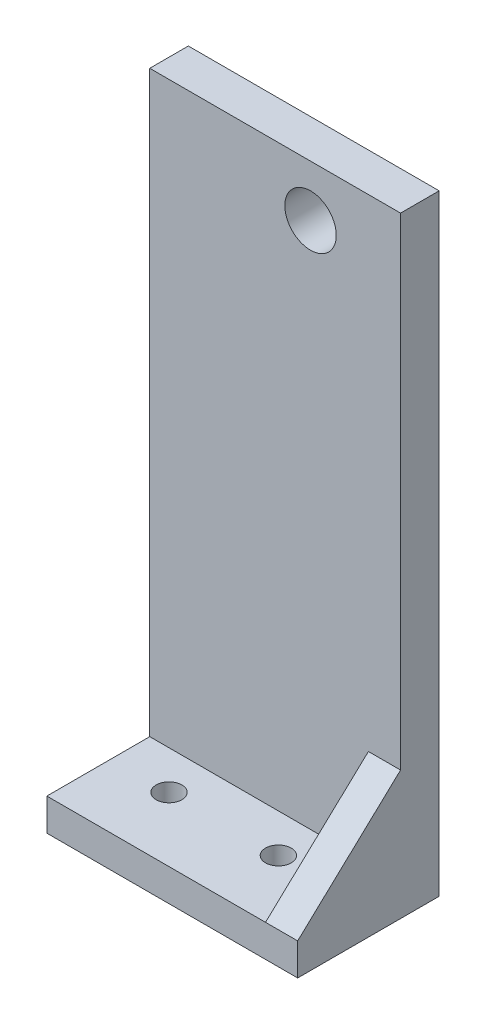
ISO-10303-21;
HEADER;
FILE_DESCRIPTION(('STEP AP214'),'2;1');
FILE_NAME('part.step','',(''),(''),'','','');
FILE_SCHEMA(('AUTOMOTIVE_DESIGN { 1 0 10303 214 1 1 1 1 }'));
ENDSEC;
DATA;
#1=APPLICATION_CONTEXT('core data for automotive mechanical design processes');
#2=APPLICATION_PROTOCOL_DEFINITION('international standard','automotive_design',2000,#1);
#3=PRODUCT_CONTEXT('',#1,'mechanical');
#4=PRODUCT('Part','Part','',(#3));
#5=PRODUCT_RELATED_PRODUCT_CATEGORY('part','',(#4));
#6=PRODUCT_DEFINITION_FORMATION('','',#4);
#7=PRODUCT_DEFINITION_CONTEXT('part definition',#1,'design');
#8=PRODUCT_DEFINITION('design','',#6,#7);
#9=PRODUCT_DEFINITION_SHAPE('','',#8);
#10=(LENGTH_UNIT() NAMED_UNIT(*) SI_UNIT(.MILLI.,.METRE.));
#11=(NAMED_UNIT(*) PLANE_ANGLE_UNIT() SI_UNIT($,.RADIAN.));
#12=(NAMED_UNIT(*) SI_UNIT($,.STERADIAN.) SOLID_ANGLE_UNIT());
#13=UNCERTAINTY_MEASURE_WITH_UNIT(LENGTH_MEASURE(1.E-05),#10,'distance_accuracy_value','');
#14=(GEOMETRIC_REPRESENTATION_CONTEXT(3) GLOBAL_UNCERTAINTY_ASSIGNED_CONTEXT((#13)) GLOBAL_UNIT_ASSIGNED_CONTEXT((#10,
#11,#12)) REPRESENTATION_CONTEXT('',''));
#15=CARTESIAN_POINT('',(0.,0.,0.));
#16=DIRECTION('',(0.,0.,1.));
#17=DIRECTION('',(1.,0.,0.));
#18=AXIS2_PLACEMENT_3D('',#15,#16,#17);
#19=CARTESIAN_POINT('',(-9.,5.,0.));
#20=DIRECTION('',(-1.,0.,0.));
#21=DIRECTION('',(0.,0.,1.));
#22=AXIS2_PLACEMENT_3D('',#19,#20,#21);
#23=PLANE('',#22);
#24=DIRECTION('',(0.,0.,-1.));
#25=VECTOR('',#24,1.);
#26=CARTESIAN_POINT('',(-9.,0.,0.));
#27=LINE('',#26,#25);
#28=CARTESIAN_POINT('',(-9.,0.,10.));
#29=VERTEX_POINT('',#28);
#30=CARTESIAN_POINT('',(-9.,0.,-12.));
#31=VERTEX_POINT('',#30);
#32=EDGE_CURVE('E185',#29,#31,#27,.T.);
#33=ORIENTED_EDGE('',*,*,#32,.F.);
#34=DIRECTION('',(0.,-1.,0.));
#35=VECTOR('',#34,1.);
#36=CARTESIAN_POINT('',(-9.,5.,10.));
#37=LINE('',#36,#35);
#38=CARTESIAN_POINT('',(-9.,5.,10.));
#39=VERTEX_POINT('',#38);
#40=EDGE_CURVE('E11',#39,#29,#37,.T.);
#41=ORIENTED_EDGE('',*,*,#40,.F.);
#42=DIRECTION('',(0.,0.,-1.));
#43=VECTOR('',#42,1.);
#44=CARTESIAN_POINT('',(-9.,5.,0.));
#45=LINE('',#44,#43);
#46=CARTESIAN_POINT('',(-9.,5.,-6.));
#47=VERTEX_POINT('',#46);
#48=EDGE_CURVE('E171',#39,#47,#45,.T.);
#49=ORIENTED_EDGE('',*,*,#48,.T.);
#50=DIRECTION('',(0.,1.,0.));
#51=VECTOR('',#50,1.);
#52=CARTESIAN_POINT('',(-9.,0.,-6.));
#53=LINE('',#52,#51);
#54=CARTESIAN_POINT('',(-9.,95.,-6.));
#55=VERTEX_POINT('',#54);
#56=EDGE_CURVE('E140',#47,#55,#53,.T.);
#57=ORIENTED_EDGE('',*,*,#56,.T.);
#58=DIRECTION('',(0.,0.,-1.));
#59=VECTOR('',#58,1.);
#60=CARTESIAN_POINT('',(-9.,95.,-6.));
#61=LINE('',#60,#59);
#62=CARTESIAN_POINT('',(-9.,95.,-12.));
#63=VERTEX_POINT('',#62);
#64=EDGE_CURVE('E149',#55,#63,#61,.T.);
#65=ORIENTED_EDGE('',*,*,#64,.T.);
#66=DIRECTION('',(0.,-1.,0.));
#67=VECTOR('',#66,1.);
#68=CARTESIAN_POINT('',(-9.,5.,-12.));
#69=LINE('',#68,#67);
#70=EDGE_CURVE('E177',#63,#31,#69,.T.);
#71=ORIENTED_EDGE('',*,*,#70,.T.);
#72=EDGE_LOOP('',(#33,#41,#49,#57,#65,#71));
#73=FACE_BOUND('',#72,.T.);
#74=ADVANCED_FACE('F41',(#73),#23,.T.);
#75=CARTESIAN_POINT('',(0.,5.,10.));
#76=DIRECTION('',(0.,0.,1.));
#77=DIRECTION('',(1.,0.,0.));
#78=AXIS2_PLACEMENT_3D('',#75,#76,#77);
#79=PLANE('',#78);
#80=DIRECTION('',(-1.,0.,0.));
#81=VECTOR('',#80,1.);
#82=CARTESIAN_POINT('',(0.,0.,10.));
#83=LINE('',#82,#81);
#84=CARTESIAN_POINT('',(30.,0.,10.));
#85=VERTEX_POINT('',#84);
#86=EDGE_CURVE('E189',#85,#29,#83,.T.);
#87=ORIENTED_EDGE('',*,*,#86,.F.);
#88=DIRECTION('',(0.,-1.,0.));
#89=VECTOR('',#88,1.);
#90=CARTESIAN_POINT('',(30.,5.,10.));
#91=LINE('',#90,#89);
#92=CARTESIAN_POINT('',(30.,5.,10.));
#93=VERTEX_POINT('',#92);
#94=EDGE_CURVE('E50',#93,#85,#91,.T.);
#95=ORIENTED_EDGE('',*,*,#94,.F.);
#96=DIRECTION('',(-1.,0.,0.));
#97=VECTOR('',#96,1.);
#98=CARTESIAN_POINT('',(0.,5.,10.));
#99=LINE('',#98,#97);
#100=CARTESIAN_POINT('',(25.,5.,10.));
#101=VERTEX_POINT('',#100);
#102=EDGE_CURVE('E126',#93,#101,#99,.T.);
#103=ORIENTED_EDGE('',*,*,#102,.T.);
#104=EDGE_CURVE('E57',#101,#39,#99,.T.);
#105=ORIENTED_EDGE('',*,*,#104,.T.);
#106=ORIENTED_EDGE('',*,*,#40,.T.);
#107=EDGE_LOOP('',(#87,#95,#103,#105,#106));
#108=FACE_BOUND('',#107,.T.);
#109=ADVANCED_FACE('F208',(#108),#79,.T.);
#110=CARTESIAN_POINT('',(30.,5.,0.));
#111=DIRECTION('',(1.,0.,0.));
#112=DIRECTION('',(0.,0.,-1.));
#113=AXIS2_PLACEMENT_3D('',#110,#111,#112);
#114=PLANE('',#113);
#115=DIRECTION('',(0.,-0.68394112888133,0.729537204140085));
#116=VECTOR('',#115,1.);
#117=CARTESIAN_POINT('',(30.,20.,-6.));
#118=LINE('',#117,#116);
#119=CARTESIAN_POINT('',(30.,20.,-6.));
#120=VERTEX_POINT('',#119);
#121=EDGE_CURVE('E108',#120,#93,#118,.T.);
#122=ORIENTED_EDGE('',*,*,#121,.T.);
#123=ORIENTED_EDGE('',*,*,#94,.T.);
#124=DIRECTION('',(0.,0.,1.));
#125=VECTOR('',#124,1.);
#126=CARTESIAN_POINT('',(30.,0.,0.));
#127=LINE('',#126,#125);
#128=CARTESIAN_POINT('',(30.,0.,-12.));
#129=VERTEX_POINT('',#128);
#130=EDGE_CURVE('E193',#129,#85,#127,.T.);
#131=ORIENTED_EDGE('',*,*,#130,.F.);
#132=DIRECTION('',(0.,-1.,0.));
#133=VECTOR('',#132,1.);
#134=CARTESIAN_POINT('',(30.,5.,-12.));
#135=LINE('',#134,#133);
#136=CARTESIAN_POINT('',(30.,95.,-12.));
#137=VERTEX_POINT('',#136);
#138=EDGE_CURVE('E202',#137,#129,#135,.T.);
#139=ORIENTED_EDGE('',*,*,#138,.F.);
#140=DIRECTION('',(0.,0.,-1.));
#141=VECTOR('',#140,1.);
#142=CARTESIAN_POINT('',(30.,95.,-6.));
#143=LINE('',#142,#141);
#144=CARTESIAN_POINT('',(30.,95.,-6.));
#145=VERTEX_POINT('',#144);
#146=EDGE_CURVE('E110',#145,#137,#143,.T.);
#147=ORIENTED_EDGE('',*,*,#146,.F.);
#148=DIRECTION('',(0.,1.,0.));
#149=VECTOR('',#148,1.);
#150=CARTESIAN_POINT('',(30.,0.,-6.));
#151=LINE('',#150,#149);
#152=EDGE_CURVE('E105',#120,#145,#151,.T.);
#153=ORIENTED_EDGE('',*,*,#152,.F.);
#154=EDGE_LOOP('',(#122,#123,#131,#139,#147,#153));
#155=FACE_BOUND('',#154,.T.);
#156=ADVANCED_FACE('F106',(#155),#114,.T.);
#157=CARTESIAN_POINT('',(0.,5.,0.));
#158=DIRECTION('',(0.,-1.,0.));
#159=DIRECTION('',(0.,0.,-1.));
#160=AXIS2_PLACEMENT_3D('',#157,#158,#159);
#161=CYLINDRICAL_SURFACE('',#160,2.);
#162=CARTESIAN_POINT('',(0.,5.,0.));
#163=DIRECTION('',(0.,1.,0.));
#164=DIRECTION('',(0.,0.,1.));
#165=AXIS2_PLACEMENT_3D('',#162,#163,#164);
#166=CIRCLE('',#165,2.);
#167=CARTESIAN_POINT('',(0.,5.,2.));
#168=VERTEX_POINT('',#167);
#169=EDGE_CURVE('E166',#168,#168,#166,.T.);
#170=ORIENTED_EDGE('',*,*,#169,.T.);
#171=EDGE_LOOP('',(#170));
#172=FACE_BOUND('',#171,.T.);
#173=CARTESIAN_POINT('',(0.,0.,0.));
#174=DIRECTION('',(0.,1.,0.));
#175=DIRECTION('',(0.,0.,1.));
#176=AXIS2_PLACEMENT_3D('',#173,#174,#175);
#177=CIRCLE('',#176,2.);
#178=CARTESIAN_POINT('',(0.,0.,2.));
#179=VERTEX_POINT('',#178);
#180=EDGE_CURVE('E181',#179,#179,#177,.T.);
#181=ORIENTED_EDGE('',*,*,#180,.F.);
#182=EDGE_LOOP('',(#181));
#183=FACE_BOUND('',#182,.T.);
#184=ADVANCED_FACE('F244',(#172,#183),#161,.F.);
#185=CARTESIAN_POINT('',(17.,5.,0.));
#186=DIRECTION('',(0.,-1.,0.));
#187=DIRECTION('',(0.,0.,-1.));
#188=AXIS2_PLACEMENT_3D('',#185,#186,#187);
#189=CYLINDRICAL_SURFACE('',#188,2.);
#190=CARTESIAN_POINT('',(17.,5.,0.));
#191=DIRECTION('',(0.,1.,0.));
#192=DIRECTION('',(0.,0.,1.));
#193=AXIS2_PLACEMENT_3D('',#190,#191,#192);
#194=CIRCLE('',#193,2.);
#195=CARTESIAN_POINT('',(17.,5.,2.));
#196=VERTEX_POINT('',#195);
#197=EDGE_CURVE('E162',#196,#196,#194,.T.);
#198=ORIENTED_EDGE('',*,*,#197,.T.);
#199=EDGE_LOOP('',(#198));
#200=FACE_BOUND('',#199,.T.);
#201=CARTESIAN_POINT('',(17.,0.,0.));
#202=DIRECTION('',(0.,1.,0.));
#203=DIRECTION('',(0.,0.,1.));
#204=AXIS2_PLACEMENT_3D('',#201,#202,#203);
#205=CIRCLE('',#204,2.);
#206=CARTESIAN_POINT('',(17.,0.,2.));
#207=VERTEX_POINT('',#206);
#208=EDGE_CURVE('E158',#207,#207,#205,.T.);
#209=ORIENTED_EDGE('',*,*,#208,.F.);
#210=EDGE_LOOP('',(#209));
#211=FACE_BOUND('',#210,.T.);
#212=ADVANCED_FACE('F43',(#200,#211),#189,.F.);
#213=CARTESIAN_POINT('',(0.,5.,-12.));
#214=DIRECTION('',(0.,0.,-1.));
#215=DIRECTION('',(-1.,0.,0.));
#216=AXIS2_PLACEMENT_3D('',#213,#214,#215);
#217=PLANE('',#216);
#218=DIRECTION('',(1.,0.,0.));
#219=VECTOR('',#218,1.);
#220=CARTESIAN_POINT('',(0.,0.,-12.));
#221=LINE('',#220,#219);
#222=EDGE_CURVE('E167',#31,#129,#221,.T.);
#223=ORIENTED_EDGE('',*,*,#222,.F.);
#224=ORIENTED_EDGE('',*,*,#70,.F.);
#225=DIRECTION('',(-1.,0.,0.));
#226=VECTOR('',#225,1.);
#227=CARTESIAN_POINT('',(0.,95.,-12.));
#228=LINE('',#227,#226);
#229=EDGE_CURVE('E141',#137,#63,#228,.T.);
#230=ORIENTED_EDGE('',*,*,#229,.F.);
#231=ORIENTED_EDGE('',*,*,#138,.T.);
#232=EDGE_LOOP('',(#223,#224,#230,#231));
#233=FACE_BOUND('',#232,.T.);
#234=CARTESIAN_POINT('',(16.,87.,-12.));
#235=DIRECTION('',(0.,0.,-1.));
#236=DIRECTION('',(-1.,0.,0.));
#237=AXIS2_PLACEMENT_3D('',#234,#235,#236);
#238=CIRCLE('',#237,4.);
#239=CARTESIAN_POINT('',(12.,87.,-12.));
#240=VERTEX_POINT('',#239);
#241=EDGE_CURVE('E122',#240,#240,#238,.T.);
#242=ORIENTED_EDGE('',*,*,#241,.F.);
#243=EDGE_LOOP('',(#242));
#244=FACE_BOUND('',#243,.T.);
#245=ADVANCED_FACE('F215',(#233,#244),#217,.T.);
#246=CARTESIAN_POINT('',(0.,5.,0.));
#247=DIRECTION('',(0.,1.,0.));
#248=DIRECTION('',(0.,0.,1.));
#249=AXIS2_PLACEMENT_3D('',#246,#247,#248);
#250=PLANE('',#249);
#251=DIRECTION('',(0.,0.,-1.));
#252=VECTOR('',#251,1.);
#253=CARTESIAN_POINT('',(25.,5.,10.));
#254=LINE('',#253,#252);
#255=CARTESIAN_POINT('',(25.,5.,-6.));
#256=VERTEX_POINT('',#255);
#257=EDGE_CURVE('E131',#101,#256,#254,.T.);
#258=ORIENTED_EDGE('',*,*,#257,.T.);
#259=DIRECTION('',(1.,0.,0.));
#260=VECTOR('',#259,1.);
#261=CARTESIAN_POINT('',(0.,5.,-6.));
#262=LINE('',#261,#260);
#263=EDGE_CURVE('E113',#47,#256,#262,.T.);
#264=ORIENTED_EDGE('',*,*,#263,.F.);
#265=ORIENTED_EDGE('',*,*,#48,.F.);
#266=ORIENTED_EDGE('',*,*,#104,.F.);
#267=EDGE_LOOP('',(#258,#264,#265,#266));
#268=FACE_BOUND('',#267,.T.);
#269=ORIENTED_EDGE('',*,*,#197,.F.);
#270=EDGE_LOOP('',(#269));
#271=FACE_BOUND('',#270,.T.);
#272=ORIENTED_EDGE('',*,*,#169,.F.);
#273=EDGE_LOOP('',(#272));
#274=FACE_BOUND('',#273,.T.);
#275=ADVANCED_FACE('F223',(#268,#271,#274),#250,.T.);
#276=CARTESIAN_POINT('',(0.,0.,0.));
#277=DIRECTION('',(0.,1.,0.));
#278=DIRECTION('',(0.,0.,1.));
#279=AXIS2_PLACEMENT_3D('',#276,#277,#278);
#280=PLANE('',#279);
#281=ORIENTED_EDGE('',*,*,#208,.T.);
#282=EDGE_LOOP('',(#281));
#283=FACE_BOUND('',#282,.T.);
#284=ORIENTED_EDGE('',*,*,#180,.T.);
#285=EDGE_LOOP('',(#284));
#286=FACE_BOUND('',#285,.T.);
#287=ORIENTED_EDGE('',*,*,#32,.T.);
#288=ORIENTED_EDGE('',*,*,#222,.T.);
#289=ORIENTED_EDGE('',*,*,#130,.T.);
#290=ORIENTED_EDGE('',*,*,#86,.T.);
#291=EDGE_LOOP('',(#287,#288,#289,#290));
#292=FACE_BOUND('',#291,.T.);
#293=ADVANCED_FACE('F212',(#283,#286,#292),#280,.F.);
#294=CARTESIAN_POINT('',(16.,87.,-6.));
#295=DIRECTION('',(0.,0.,-1.));
#296=DIRECTION('',(-1.,0.,0.));
#297=AXIS2_PLACEMENT_3D('',#294,#295,#296);
#298=CYLINDRICAL_SURFACE('',#297,4.);
#299=CARTESIAN_POINT('',(16.,87.,-6.));
#300=DIRECTION('',(0.,0.,-1.));
#301=DIRECTION('',(-1.,0.,0.));
#302=AXIS2_PLACEMENT_3D('',#299,#300,#301);
#303=CIRCLE('',#302,4.);
#304=CARTESIAN_POINT('',(12.,87.,-6.));
#305=VERTEX_POINT('',#304);
#306=EDGE_CURVE('E136',#305,#305,#303,.T.);
#307=ORIENTED_EDGE('',*,*,#306,.F.);
#308=EDGE_LOOP('',(#307));
#309=FACE_BOUND('',#308,.T.);
#310=ORIENTED_EDGE('',*,*,#241,.T.);
#311=EDGE_LOOP('',(#310));
#312=FACE_BOUND('',#311,.T.);
#313=ADVANCED_FACE('F257',(#309,#312),#298,.F.);
#314=CARTESIAN_POINT('',(0.,95.,-6.));
#315=DIRECTION('',(0.,-1.,0.));
#316=DIRECTION('',(0.,0.,-1.));
#317=AXIS2_PLACEMENT_3D('',#314,#315,#316);
#318=PLANE('',#317);
#319=ORIENTED_EDGE('',*,*,#229,.T.);
#320=ORIENTED_EDGE('',*,*,#64,.F.);
#321=DIRECTION('',(-1.,0.,0.));
#322=VECTOR('',#321,1.);
#323=CARTESIAN_POINT('',(0.,95.,-6.));
#324=LINE('',#323,#322);
#325=EDGE_CURVE('E114',#145,#55,#324,.T.);
#326=ORIENTED_EDGE('',*,*,#325,.F.);
#327=ORIENTED_EDGE('',*,*,#146,.T.);
#328=EDGE_LOOP('',(#319,#320,#326,#327));
#329=FACE_BOUND('',#328,.T.);
#330=ADVANCED_FACE('F220',(#329),#318,.F.);
#331=CARTESIAN_POINT('',(0.,0.,-6.));
#332=DIRECTION('',(0.,0.,-1.));
#333=DIRECTION('',(-1.,0.,0.));
#334=AXIS2_PLACEMENT_3D('',#331,#332,#333);
#335=PLANE('',#334);
#336=ORIENTED_EDGE('',*,*,#306,.T.);
#337=EDGE_LOOP('',(#336));
#338=FACE_BOUND('',#337,.T.);
#339=DIRECTION('',(0.,1.,0.));
#340=VECTOR('',#339,1.);
#341=CARTESIAN_POINT('',(25.,5.,-6.));
#342=LINE('',#341,#340);
#343=CARTESIAN_POINT('',(25.,20.,-6.));
#344=VERTEX_POINT('',#343);
#345=EDGE_CURVE('E65',#256,#344,#342,.T.);
#346=ORIENTED_EDGE('',*,*,#345,.T.);
#347=DIRECTION('',(1.,0.,0.));
#348=VECTOR('',#347,1.);
#349=CARTESIAN_POINT('',(25.,20.,-6.));
#350=LINE('',#349,#348);
#351=EDGE_CURVE('E116',#344,#120,#350,.T.);
#352=ORIENTED_EDGE('',*,*,#351,.T.);
#353=ORIENTED_EDGE('',*,*,#152,.T.);
#354=ORIENTED_EDGE('',*,*,#325,.T.);
#355=ORIENTED_EDGE('',*,*,#56,.F.);
#356=ORIENTED_EDGE('',*,*,#263,.T.);
#357=EDGE_LOOP('',(#346,#352,#353,#354,#355,#356));
#358=FACE_BOUND('',#357,.T.);
#359=ADVANCED_FACE('F117',(#338,#358),#335,.F.);
#360=CARTESIAN_POINT('',(25.,20.,-6.));
#361=DIRECTION('',(0.,0.729537204140085,0.68394112888133));
#362=DIRECTION('',(0.,-0.68394112888133,0.729537204140085));
#363=AXIS2_PLACEMENT_3D('',#360,#361,#362);
#364=PLANE('',#363);
#365=ORIENTED_EDGE('',*,*,#121,.F.);
#366=ORIENTED_EDGE('',*,*,#351,.F.);
#367=DIRECTION('',(0.,-0.68394112888133,0.729537204140085));
#368=VECTOR('',#367,1.);
#369=CARTESIAN_POINT('',(25.,20.,-6.));
#370=LINE('',#369,#368);
#371=EDGE_CURVE('E128',#344,#101,#370,.T.);
#372=ORIENTED_EDGE('',*,*,#371,.T.);
#373=ORIENTED_EDGE('',*,*,#102,.F.);
#374=EDGE_LOOP('',(#365,#366,#372,#373));
#375=FACE_BOUND('',#374,.T.);
#376=ADVANCED_FACE('F125',(#375),#364,.T.);
#377=CARTESIAN_POINT('',(25.,0.,0.));
#378=DIRECTION('',(-1.,0.,0.));
#379=DIRECTION('',(0.,0.,1.));
#380=AXIS2_PLACEMENT_3D('',#377,#378,#379);
#381=PLANE('',#380);
#382=ORIENTED_EDGE('',*,*,#371,.F.);
#383=ORIENTED_EDGE('',*,*,#345,.F.);
#384=ORIENTED_EDGE('',*,*,#257,.F.);
#385=EDGE_LOOP('',(#382,#383,#384));
#386=FACE_BOUND('',#385,.T.);
#387=ADVANCED_FACE('F230',(#386),#381,.T.);
#388=CLOSED_SHELL('',(#74,#109,#156,#184,#212,#245,#275,#293,#313,#330,#359,#376,#387));
#389=MANIFOLD_SOLID_BREP('B2',#388);
#390=ADVANCED_BREP_SHAPE_REPRESENTATION('',(#18,#389),#14);
#391=SHAPE_DEFINITION_REPRESENTATION(#9,#390);
ENDSEC;
END-ISO-10303-21;
